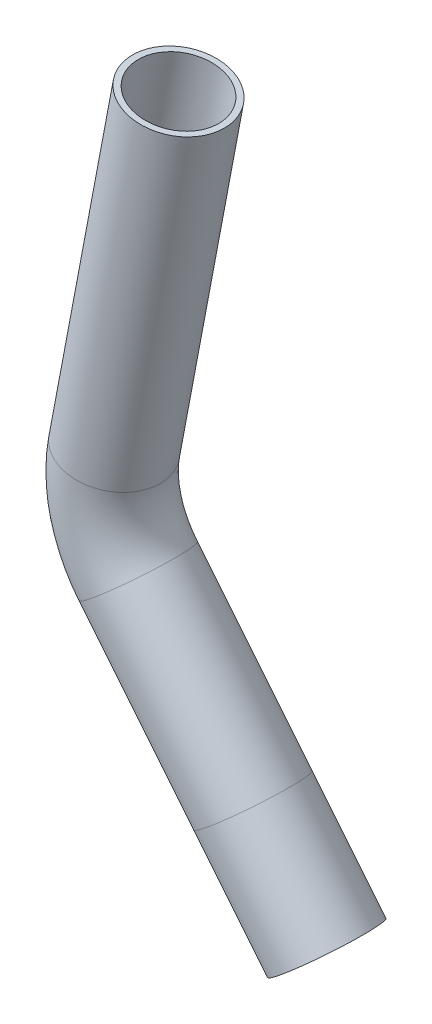
ISO-10303-21;
HEADER;
FILE_DESCRIPTION(('STEP AP214'),'2;1');
FILE_NAME('part.step','',(''),(''),'','','');
FILE_SCHEMA(('AUTOMOTIVE_DESIGN { 1 0 10303 214 1 1 1 1 }'));
ENDSEC;
DATA;
#1=APPLICATION_CONTEXT('core data for automotive mechanical design processes');
#2=APPLICATION_PROTOCOL_DEFINITION('international standard','automotive_design',2000,#1);
#3=PRODUCT_CONTEXT('',#1,'mechanical');
#4=PRODUCT('Part','Part','',(#3));
#5=PRODUCT_RELATED_PRODUCT_CATEGORY('part','',(#4));
#6=PRODUCT_DEFINITION_FORMATION('','',#4);
#7=PRODUCT_DEFINITION_CONTEXT('part definition',#1,'design');
#8=PRODUCT_DEFINITION('design','',#6,#7);
#9=PRODUCT_DEFINITION_SHAPE('','',#8);
#10=(LENGTH_UNIT() NAMED_UNIT(*) SI_UNIT(.MILLI.,.METRE.));
#11=(NAMED_UNIT(*) PLANE_ANGLE_UNIT() SI_UNIT($,.RADIAN.));
#12=(NAMED_UNIT(*) SI_UNIT($,.STERADIAN.) SOLID_ANGLE_UNIT());
#13=UNCERTAINTY_MEASURE_WITH_UNIT(LENGTH_MEASURE(1.E-05),#10,'distance_accuracy_value','');
#14=(GEOMETRIC_REPRESENTATION_CONTEXT(3) GLOBAL_UNCERTAINTY_ASSIGNED_CONTEXT((#13)) GLOBAL_UNIT_ASSIGNED_CONTEXT((#10,
#11,#12)) REPRESENTATION_CONTEXT('',''));
#15=CARTESIAN_POINT('',(0.,0.,0.));
#16=DIRECTION('',(0.,0.,1.));
#17=DIRECTION('',(1.,0.,0.));
#18=AXIS2_PLACEMENT_3D('',#15,#16,#17);
#19=CARTESIAN_POINT('',(-12.6705902595337,57.0464869394673,0.));
#20=DIRECTION('',(-0.186016121361984,-0.982546692322275,0.));
#21=DIRECTION('',(0.982546692322275,-0.186016121361984,0.));
#22=AXIS2_PLACEMENT_3D('',#19,#20,#21);
#23=CYLINDRICAL_SURFACE('',#22,4.);
#24=CARTESIAN_POINT('',(-18.1715152174962,27.9903192127936,0.));
#25=DIRECTION('',(-0.186016121361984,-0.982546692322275,0.));
#26=DIRECTION('',(0.982546692322275,-0.186016121361984,0.));
#27=AXIS2_PLACEMENT_3D('',#24,#25,#26);
#28=CIRCLE('',#27,4.);
#29=CARTESIAN_POINT('',(-22.1017019867853,28.7343836982415,0.));
#30=VERTEX_POINT('',#29);
#31=EDGE_CURVE('E82',#30,#30,#28,.T.);
#32=ORIENTED_EDGE('',*,*,#31,.F.);
#33=EDGE_LOOP('',(#32));
#34=FACE_BOUND('',#33,.T.);
#35=CARTESIAN_POINT('',(-12.6705902595337,57.0464869394673,0.));
#36=DIRECTION('',(-0.186016121361984,-0.982546692322275,0.));
#37=DIRECTION('',(0.982546692322275,-0.186016121361984,0.));
#38=AXIS2_PLACEMENT_3D('',#35,#36,#37);
#39=CIRCLE('',#38,4.);
#40=CARTESIAN_POINT('',(-8.74040349024455,56.3024224540194,0.));
#41=VERTEX_POINT('',#40);
#42=EDGE_CURVE('E49',#41,#41,#39,.T.);
#43=ORIENTED_EDGE('',*,*,#42,.T.);
#44=EDGE_LOOP('',(#43));
#45=FACE_BOUND('',#44,.T.);
#46=ADVANCED_FACE('F34',(#34,#45),#23,.T.);
#47=CARTESIAN_POINT('',(-8.34604829427341,26.1301579991737,0.));
#48=DIRECTION('',(0.,0.,1.));
#49=DIRECTION('',(1.,0.,0.));
#50=AXIS2_PLACEMENT_3D('',#47,#48,#49);
#51=TOROIDAL_SURFACE('',#50,10.,4.);
#52=CARTESIAN_POINT('',(-16.107188295436,19.824231748229,0.));
#53=DIRECTION('',(0.630592625094466,-0.776114000116266,0.));
#54=DIRECTION('',(0.776114000116266,0.630592625094466,0.));
#55=AXIS2_PLACEMENT_3D('',#52,#53,#54);
#56=CIRCLE('',#55,4.);
#57=CARTESIAN_POINT('',(-19.2116442959011,17.3018612478511,0.));
#58=VERTEX_POINT('',#57);
#59=EDGE_CURVE('E84',#58,#58,#56,.T.);
#60=CARTESIAN_POINT('',(-8.34604829427341,26.1301579991737,0.));
#61=DIRECTION('',(0.,0.,1.));
#62=DIRECTION('',(1.,0.,0.));
#63=AXIS2_PLACEMENT_3D('',#60,#61,#62);
#64=CIRCLE('',#63,14.);
#65=EDGE_CURVE('',#30,#58,#64,.T.);
#66=ORIENTED_EDGE('',*,*,#31,.T.);
#67=ORIENTED_EDGE('',*,*,#59,.F.);
#68=ORIENTED_EDGE('',*,*,#65,.T.);
#69=ORIENTED_EDGE('',*,*,#65,.F.);
#70=EDGE_LOOP('',(#66,#68,#67,#69));
#71=FACE_BOUND('',#70,.T.);
#72=ADVANCED_FACE('F94',(#71),#51,.T.);
#73=CARTESIAN_POINT('',(-16.107188295436,19.824231748229,0.));
#74=DIRECTION('',(0.630592625094466,-0.776114000116266,0.));
#75=DIRECTION('',(0.776114000116266,0.630592625094466,0.));
#76=AXIS2_PLACEMENT_3D('',#73,#74,#75);
#77=CYLINDRICAL_SURFACE('',#76,4.);
#78=CARTESIAN_POINT('',(-6.30592625094465,7.76114000116265,0.));
#79=DIRECTION('',(0.630592625094466,-0.776114000116266,0.));
#80=DIRECTION('',(0.776114000116266,0.630592625094466,0.));
#81=AXIS2_PLACEMENT_3D('',#78,#79,#80);
#82=CIRCLE('',#81,4.);
#83=CARTESIAN_POINT('',(-3.20147025047959,10.2835105015405,0.));
#84=VERTEX_POINT('',#83);
#85=EDGE_CURVE('E38',#84,#84,#82,.T.);
#86=ORIENTED_EDGE('',*,*,#85,.F.);
#87=EDGE_LOOP('',(#86));
#88=FACE_BOUND('',#87,.T.);
#89=ORIENTED_EDGE('',*,*,#59,.T.);
#90=EDGE_LOOP('',(#89));
#91=FACE_BOUND('',#90,.T.);
#92=ADVANCED_FACE('F92',(#88,#91),#77,.T.);
#93=CARTESIAN_POINT('',(-6.30592625094465,7.76114000116265,0.));
#94=DIRECTION('',(0.630592625094465,-0.776114000116266,0.));
#95=DIRECTION('',(0.776114000116266,0.630592625094465,0.));
#96=AXIS2_PLACEMENT_3D('',#93,#94,#95);
#97=CYLINDRICAL_SURFACE('',#96,4.);
#98=CARTESIAN_POINT('',(0.,0.,0.));
#99=DIRECTION('',(0.630592625094466,-0.776114000116266,0.));
#100=DIRECTION('',(0.776114000116266,0.630592625094466,0.));
#101=AXIS2_PLACEMENT_3D('',#98,#99,#100);
#102=CIRCLE('',#101,4.);
#103=CARTESIAN_POINT('',(3.10445600046506,2.52237050037786,0.));
#104=VERTEX_POINT('',#103);
#105=EDGE_CURVE('E54',#104,#104,#102,.T.);
#106=ORIENTED_EDGE('',*,*,#105,.F.);
#107=EDGE_LOOP('',(#106));
#108=FACE_BOUND('',#107,.T.);
#109=ORIENTED_EDGE('',*,*,#85,.T.);
#110=EDGE_LOOP('',(#109));
#111=FACE_BOUND('',#110,.T.);
#112=ADVANCED_FACE('F36',(#108,#111),#97,.T.);
#113=CARTESIAN_POINT('',(-12.6705902595337,57.0464869394673,0.));
#114=DIRECTION('',(-0.186016121361984,-0.982546692322275,0.));
#115=DIRECTION('',(0.982546692322275,-0.186016121361984,0.));
#116=AXIS2_PLACEMENT_3D('',#113,#114,#115);
#117=PLANE('',#116);
#118=CARTESIAN_POINT('',(-12.6705902595337,57.0464869394673,0.));
#119=DIRECTION('',(-0.186016121361984,-0.982546692322275,0.));
#120=DIRECTION('',(0.982546692322275,-0.186016121361984,0.));
#121=AXIS2_PLACEMENT_3D('',#118,#119,#120);
#122=CIRCLE('',#121,3.5);
#123=CARTESIAN_POINT('',(-9.23167683640569,56.3954305147004,0.));
#124=VERTEX_POINT('',#123);
#125=EDGE_CURVE('E80',#124,#124,#122,.F.);
#126=ORIENTED_EDGE('',*,*,#125,.F.);
#127=EDGE_LOOP('',(#126));
#128=FACE_BOUND('',#127,.T.);
#129=ORIENTED_EDGE('',*,*,#42,.F.);
#130=EDGE_LOOP('',(#129));
#131=FACE_BOUND('',#130,.T.);
#132=ADVANCED_FACE('F99',(#128,#131),#117,.F.);
#133=CARTESIAN_POINT('',(0.,0.,0.));
#134=DIRECTION('',(0.630592625094466,-0.776114000116266,0.));
#135=DIRECTION('',(0.776114000116266,0.630592625094466,0.));
#136=AXIS2_PLACEMENT_3D('',#133,#134,#135);
#137=PLANE('',#136);
#138=CARTESIAN_POINT('',(0.,0.,0.));
#139=DIRECTION('',(0.630592625094466,-0.776114000116266,0.));
#140=DIRECTION('',(0.776114000116266,0.630592625094466,0.));
#141=AXIS2_PLACEMENT_3D('',#138,#139,#140);
#142=CIRCLE('',#141,3.5);
#143=CARTESIAN_POINT('',(2.71639900040693,2.20707418783063,0.));
#144=VERTEX_POINT('',#143);
#145=EDGE_CURVE('E11',#144,#144,#142,.F.);
#146=ORIENTED_EDGE('',*,*,#145,.T.);
#147=EDGE_LOOP('',(#146));
#148=FACE_BOUND('',#147,.T.);
#149=ORIENTED_EDGE('',*,*,#105,.T.);
#150=EDGE_LOOP('',(#149));
#151=FACE_BOUND('',#150,.T.);
#152=ADVANCED_FACE('F61',(#148,#151),#137,.T.);
#153=CARTESIAN_POINT('',(-12.6705902595337,57.0464869394673,0.));
#154=DIRECTION('',(-0.186016121361984,-0.982546692322275,0.));
#155=DIRECTION('',(0.982546692322275,-0.186016121361984,0.));
#156=AXIS2_PLACEMENT_3D('',#153,#154,#155);
#157=CYLINDRICAL_SURFACE('',#156,3.5);
#158=CARTESIAN_POINT('',(-18.1715152174962,27.9903192127936,0.));
#159=DIRECTION('',(-0.186016121361984,-0.982546692322275,0.));
#160=DIRECTION('',(0.982546692322275,-0.186016121361984,0.));
#161=AXIS2_PLACEMENT_3D('',#158,#159,#160);
#162=CIRCLE('',#161,3.5);
#163=CARTESIAN_POINT('',(-21.6104286406241,28.6413756375605,0.));
#164=VERTEX_POINT('',#163);
#165=EDGE_CURVE('E75',#164,#164,#162,.F.);
#166=ORIENTED_EDGE('',*,*,#165,.F.);
#167=EDGE_LOOP('',(#166));
#168=FACE_BOUND('',#167,.T.);
#169=ORIENTED_EDGE('',*,*,#125,.T.);
#170=EDGE_LOOP('',(#169));
#171=FACE_BOUND('',#170,.T.);
#172=ADVANCED_FACE('F110',(#168,#171),#157,.F.);
#173=CARTESIAN_POINT('',(-8.34604829427341,26.1301579991737,0.));
#174=DIRECTION('',(0.,0.,1.));
#175=DIRECTION('',(1.,0.,0.));
#176=AXIS2_PLACEMENT_3D('',#173,#174,#175);
#177=TOROIDAL_SURFACE('',#176,10.,3.5);
#178=CARTESIAN_POINT('',(-16.107188295436,19.824231748229,0.));
#179=DIRECTION('',(0.630592625094466,-0.776114000116266,0.));
#180=DIRECTION('',(0.776114000116266,0.630592625094466,0.));
#181=AXIS2_PLACEMENT_3D('',#178,#179,#180);
#182=CIRCLE('',#181,3.5);
#183=CARTESIAN_POINT('',(-18.823587295843,17.6171575603984,0.));
#184=VERTEX_POINT('',#183);
#185=EDGE_CURVE('E72',#184,#184,#182,.F.);
#186=CARTESIAN_POINT('',(-8.34604829427341,26.1301579991737,0.));
#187=DIRECTION('',(0.,0.,1.));
#188=DIRECTION('',(1.,0.,0.));
#189=AXIS2_PLACEMENT_3D('',#186,#187,#188);
#190=CIRCLE('',#189,13.5);
#191=EDGE_CURVE('',#164,#184,#190,.T.);
#192=ORIENTED_EDGE('',*,*,#165,.T.);
#193=ORIENTED_EDGE('',*,*,#185,.F.);
#194=ORIENTED_EDGE('',*,*,#191,.T.);
#195=ORIENTED_EDGE('',*,*,#191,.F.);
#196=EDGE_LOOP('',(#192,#194,#193,#195));
#197=FACE_BOUND('',#196,.T.);
#198=ADVANCED_FACE('F114',(#197),#177,.F.);
#199=CARTESIAN_POINT('',(-16.107188295436,19.824231748229,0.));
#200=DIRECTION('',(0.630592625094466,-0.776114000116266,0.));
#201=DIRECTION('',(0.776114000116266,0.630592625094466,0.));
#202=AXIS2_PLACEMENT_3D('',#199,#200,#201);
#203=CYLINDRICAL_SURFACE('',#202,3.5);
#204=CARTESIAN_POINT('',(-6.30592625094465,7.76114000116265,0.));
#205=DIRECTION('',(0.630592625094466,-0.776114000116266,0.));
#206=DIRECTION('',(0.776114000116266,0.630592625094466,0.));
#207=AXIS2_PLACEMENT_3D('',#204,#205,#206);
#208=CIRCLE('',#207,3.5);
#209=CARTESIAN_POINT('',(-3.58952725053772,9.96821418899328,0.));
#210=VERTEX_POINT('',#209);
#211=EDGE_CURVE('E43',#210,#210,#208,.F.);
#212=ORIENTED_EDGE('',*,*,#211,.F.);
#213=EDGE_LOOP('',(#212));
#214=FACE_BOUND('',#213,.T.);
#215=ORIENTED_EDGE('',*,*,#185,.T.);
#216=EDGE_LOOP('',(#215));
#217=FACE_BOUND('',#216,.T.);
#218=ADVANCED_FACE('F67',(#214,#217),#203,.F.);
#219=CARTESIAN_POINT('',(-6.30592625094465,7.76114000116265,0.));
#220=DIRECTION('',(0.630592625094465,-0.776114000116266,0.));
#221=DIRECTION('',(0.776114000116266,0.630592625094465,0.));
#222=AXIS2_PLACEMENT_3D('',#219,#220,#221);
#223=CYLINDRICAL_SURFACE('',#222,3.5);
#224=ORIENTED_EDGE('',*,*,#145,.F.);
#225=EDGE_LOOP('',(#224));
#226=FACE_BOUND('',#225,.T.);
#227=ORIENTED_EDGE('',*,*,#211,.T.);
#228=EDGE_LOOP('',(#227));
#229=FACE_BOUND('',#228,.T.);
#230=ADVANCED_FACE('F64',(#226,#229),#223,.F.);
#231=CLOSED_SHELL('',(#46,#72,#92,#112,#132,#152,#172,#198,#218,#230));
#232=MANIFOLD_SOLID_BREP('B2',#231);
#233=ADVANCED_BREP_SHAPE_REPRESENTATION('',(#18,#232),#14);
#234=SHAPE_DEFINITION_REPRESENTATION(#9,#233);
ENDSEC;
END-ISO-10303-21;
